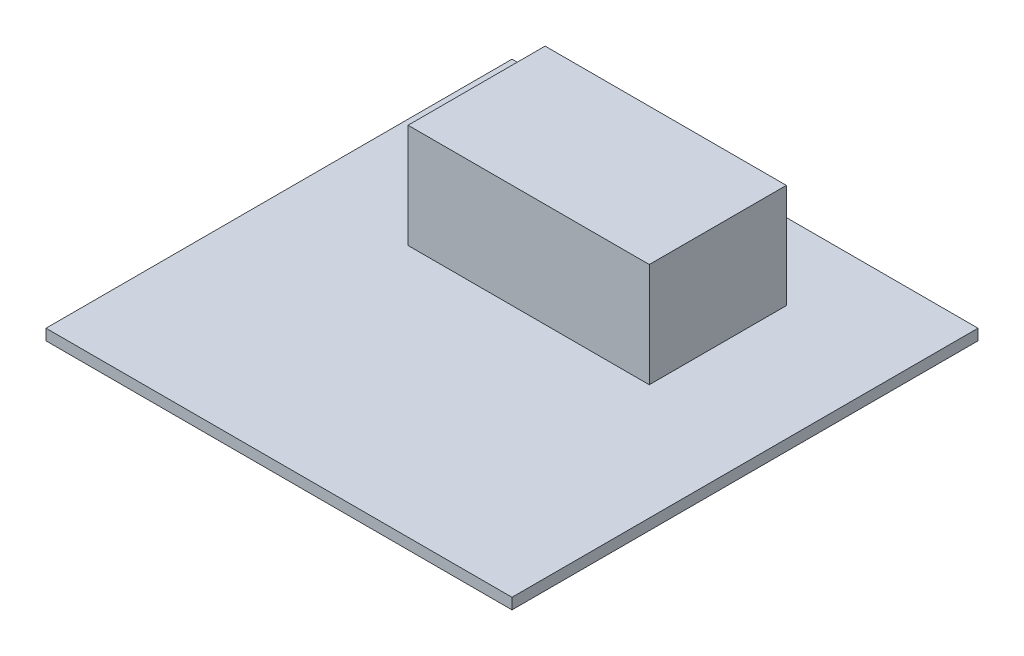
ISO-10303-21;
HEADER;
FILE_DESCRIPTION(('STEP AP214'),'2;1');
FILE_NAME('part.step','',(''),(''),'','','');
FILE_SCHEMA(('AUTOMOTIVE_DESIGN { 1 0 10303 214 1 1 1 1 }'));
ENDSEC;
DATA;
#1=APPLICATION_CONTEXT('core data for automotive mechanical design processes');
#2=APPLICATION_PROTOCOL_DEFINITION('international standard','automotive_design',2000,#1);
#3=PRODUCT_CONTEXT('',#1,'mechanical');
#4=PRODUCT('Part','Part','',(#3));
#5=PRODUCT_RELATED_PRODUCT_CATEGORY('part','',(#4));
#6=PRODUCT_DEFINITION_FORMATION('','',#4);
#7=PRODUCT_DEFINITION_CONTEXT('part definition',#1,'design');
#8=PRODUCT_DEFINITION('design','',#6,#7);
#9=PRODUCT_DEFINITION_SHAPE('','',#8);
#10=(LENGTH_UNIT() NAMED_UNIT(*) SI_UNIT(.MILLI.,.METRE.));
#11=(NAMED_UNIT(*) PLANE_ANGLE_UNIT() SI_UNIT($,.RADIAN.));
#12=(NAMED_UNIT(*) SI_UNIT($,.STERADIAN.) SOLID_ANGLE_UNIT());
#13=UNCERTAINTY_MEASURE_WITH_UNIT(LENGTH_MEASURE(1.E-05),#10,'distance_accuracy_value','');
#14=(GEOMETRIC_REPRESENTATION_CONTEXT(3) GLOBAL_UNCERTAINTY_ASSIGNED_CONTEXT((#13)) GLOBAL_UNIT_ASSIGNED_CONTEXT((#10,
#11,#12)) REPRESENTATION_CONTEXT('',''));
#15=CARTESIAN_POINT('',(0.,0.,0.));
#16=DIRECTION('',(0.,0.,1.));
#17=DIRECTION('',(1.,0.,0.));
#18=AXIS2_PLACEMENT_3D('',#15,#16,#17);
#19=CARTESIAN_POINT('',(0.,4.,0.));
#20=DIRECTION('',(0.,1.,0.));
#21=DIRECTION('',(0.,0.,1.));
#22=AXIS2_PLACEMENT_3D('',#19,#20,#21);
#23=PLANE('',#22);
#24=DIRECTION('',(0.,0.,1.));
#25=VECTOR('',#24,1.);
#26=CARTESIAN_POINT('',(0.,4.,0.));
#27=LINE('',#26,#25);
#28=CARTESIAN_POINT('',(0.,4.,0.));
#29=VERTEX_POINT('',#28);
#30=CARTESIAN_POINT('',(0.,4.,170.));
#31=VERTEX_POINT('',#30);
#32=EDGE_CURVE('E158',#29,#31,#27,.T.);
#33=ORIENTED_EDGE('',*,*,#32,.T.);
#34=DIRECTION('',(1.,0.,0.));
#35=VECTOR('',#34,1.);
#36=CARTESIAN_POINT('',(0.,4.,170.));
#37=LINE('',#36,#35);
#38=CARTESIAN_POINT('',(170.,4.,170.));
#39=VERTEX_POINT('',#38);
#40=EDGE_CURVE('E98',#31,#39,#37,.T.);
#41=ORIENTED_EDGE('',*,*,#40,.T.);
#42=DIRECTION('',(0.,0.,-1.));
#43=VECTOR('',#42,1.);
#44=CARTESIAN_POINT('',(170.,4.,0.));
#45=LINE('',#44,#43);
#46=CARTESIAN_POINT('',(170.,4.,0.));
#47=VERTEX_POINT('',#46);
#48=EDGE_CURVE('E163',#39,#47,#45,.T.);
#49=ORIENTED_EDGE('',*,*,#48,.T.);
#50=DIRECTION('',(-1.,0.,0.));
#51=VECTOR('',#50,1.);
#52=CARTESIAN_POINT('',(0.,4.,0.));
#53=LINE('',#52,#51);
#54=EDGE_CURVE('E70',#47,#29,#53,.T.);
#55=ORIENTED_EDGE('',*,*,#54,.T.);
#56=EDGE_LOOP('',(#33,#41,#49,#55));
#57=FACE_BOUND('',#56,.T.);
#58=DIRECTION('',(1.,0.,0.));
#59=VECTOR('',#58,1.);
#60=CARTESIAN_POINT('',(39.9123901461492,4.,77.8311216564133));
#61=LINE('',#60,#59);
#62=CARTESIAN_POINT('',(39.9123901461492,4.,77.8311216564133));
#63=VERTEX_POINT('',#62);
#64=CARTESIAN_POINT('',(127.912390146149,4.,77.8311216564133));
#65=VERTEX_POINT('',#64);
#66=EDGE_CURVE('E293',#63,#65,#61,.T.);
#67=ORIENTED_EDGE('',*,*,#66,.F.);
#68=DIRECTION('',(0.,0.,1.));
#69=VECTOR('',#68,1.);
#70=CARTESIAN_POINT('',(39.9123901461492,4.,27.8311216564133));
#71=LINE('',#70,#69);
#72=CARTESIAN_POINT('',(39.9123901461492,4.,27.8311216564133));
#73=VERTEX_POINT('',#72);
#74=EDGE_CURVE('E145',#73,#63,#71,.T.);
#75=ORIENTED_EDGE('',*,*,#74,.F.);
#76=DIRECTION('',(-1.,0.,0.));
#77=VECTOR('',#76,1.);
#78=CARTESIAN_POINT('',(39.9123901461492,4.,27.8311216564133));
#79=LINE('',#78,#77);
#80=CARTESIAN_POINT('',(127.912390146149,4.,27.8311216564133));
#81=VERTEX_POINT('',#80);
#82=EDGE_CURVE('E141',#81,#73,#79,.T.);
#83=ORIENTED_EDGE('',*,*,#82,.F.);
#84=DIRECTION('',(0.,0.,-1.));
#85=VECTOR('',#84,1.);
#86=CARTESIAN_POINT('',(127.912390146149,4.,27.8311216564133));
#87=LINE('',#86,#85);
#88=EDGE_CURVE('E289',#65,#81,#87,.T.);
#89=ORIENTED_EDGE('',*,*,#88,.F.);
#90=EDGE_LOOP('',(#67,#75,#83,#89));
#91=FACE_BOUND('',#90,.T.);
#92=ADVANCED_FACE('F45',(#57,#91),#23,.T.);
#93=CARTESIAN_POINT('',(0.,4.,0.));
#94=DIRECTION('',(1.,0.,0.));
#95=DIRECTION('',(0.,0.,-1.));
#96=AXIS2_PLACEMENT_3D('',#93,#94,#95);
#97=PLANE('',#96);
#98=DIRECTION('',(0.,0.,1.));
#99=VECTOR('',#98,1.);
#100=CARTESIAN_POINT('',(0.,0.,0.));
#101=LINE('',#100,#99);
#102=CARTESIAN_POINT('',(0.,0.,0.));
#103=VERTEX_POINT('',#102);
#104=CARTESIAN_POINT('',(0.,0.,170.));
#105=VERTEX_POINT('',#104);
#106=EDGE_CURVE('E148',#103,#105,#101,.T.);
#107=ORIENTED_EDGE('',*,*,#106,.T.);
#108=DIRECTION('',(0.,-1.,0.));
#109=VECTOR('',#108,1.);
#110=CARTESIAN_POINT('',(0.,4.,170.));
#111=LINE('',#110,#109);
#112=EDGE_CURVE('E11',#31,#105,#111,.T.);
#113=ORIENTED_EDGE('',*,*,#112,.F.);
#114=ORIENTED_EDGE('',*,*,#32,.F.);
#115=DIRECTION('',(0.,-1.,0.));
#116=VECTOR('',#115,1.);
#117=CARTESIAN_POINT('',(0.,4.,0.));
#118=LINE('',#117,#116);
#119=EDGE_CURVE('E167',#29,#103,#118,.T.);
#120=ORIENTED_EDGE('',*,*,#119,.T.);
#121=EDGE_LOOP('',(#107,#113,#114,#120));
#122=FACE_BOUND('',#121,.T.);
#123=ADVANCED_FACE('F47',(#122),#97,.F.);
#124=CARTESIAN_POINT('',(0.,4.,170.));
#125=DIRECTION('',(0.,0.,-1.));
#126=DIRECTION('',(-1.,0.,0.));
#127=AXIS2_PLACEMENT_3D('',#124,#125,#126);
#128=PLANE('',#127);
#129=DIRECTION('',(1.,0.,0.));
#130=VECTOR('',#129,1.);
#131=CARTESIAN_POINT('',(0.,0.,170.));
#132=LINE('',#131,#130);
#133=CARTESIAN_POINT('',(170.,0.,170.));
#134=VERTEX_POINT('',#133);
#135=EDGE_CURVE('E153',#105,#134,#132,.T.);
#136=ORIENTED_EDGE('',*,*,#135,.T.);
#137=DIRECTION('',(0.,-1.,0.));
#138=VECTOR('',#137,1.);
#139=CARTESIAN_POINT('',(170.,4.,170.));
#140=LINE('',#139,#138);
#141=EDGE_CURVE('E54',#39,#134,#140,.T.);
#142=ORIENTED_EDGE('',*,*,#141,.F.);
#143=ORIENTED_EDGE('',*,*,#40,.F.);
#144=ORIENTED_EDGE('',*,*,#112,.T.);
#145=EDGE_LOOP('',(#136,#142,#143,#144));
#146=FACE_BOUND('',#145,.T.);
#147=ADVANCED_FACE('F201',(#146),#128,.F.);
#148=CARTESIAN_POINT('',(170.,4.,0.));
#149=DIRECTION('',(-1.,0.,0.));
#150=DIRECTION('',(0.,0.,1.));
#151=AXIS2_PLACEMENT_3D('',#148,#149,#150);
#152=PLANE('',#151);
#153=DIRECTION('',(0.,0.,-1.));
#154=VECTOR('',#153,1.);
#155=CARTESIAN_POINT('',(170.,0.,0.));
#156=LINE('',#155,#154);
#157=CARTESIAN_POINT('',(170.,0.,0.));
#158=VERTEX_POINT('',#157);
#159=EDGE_CURVE('E171',#134,#158,#156,.T.);
#160=ORIENTED_EDGE('',*,*,#159,.T.);
#161=DIRECTION('',(0.,-1.,0.));
#162=VECTOR('',#161,1.);
#163=CARTESIAN_POINT('',(170.,4.,0.));
#164=LINE('',#163,#162);
#165=EDGE_CURVE('E178',#47,#158,#164,.T.);
#166=ORIENTED_EDGE('',*,*,#165,.F.);
#167=ORIENTED_EDGE('',*,*,#48,.F.);
#168=ORIENTED_EDGE('',*,*,#141,.T.);
#169=EDGE_LOOP('',(#160,#166,#167,#168));
#170=FACE_BOUND('',#169,.T.);
#171=ADVANCED_FACE('F185',(#170),#152,.F.);
#172=CARTESIAN_POINT('',(0.,4.,0.));
#173=DIRECTION('',(0.,0.,1.));
#174=DIRECTION('',(1.,0.,0.));
#175=AXIS2_PLACEMENT_3D('',#172,#173,#174);
#176=PLANE('',#175);
#177=DIRECTION('',(-1.,0.,0.));
#178=VECTOR('',#177,1.);
#179=CARTESIAN_POINT('',(0.,0.,0.));
#180=LINE('',#179,#178);
#181=EDGE_CURVE('E91',#158,#103,#180,.T.);
#182=ORIENTED_EDGE('',*,*,#181,.T.);
#183=ORIENTED_EDGE('',*,*,#119,.F.);
#184=ORIENTED_EDGE('',*,*,#54,.F.);
#185=ORIENTED_EDGE('',*,*,#165,.T.);
#186=EDGE_LOOP('',(#182,#183,#184,#185));
#187=FACE_BOUND('',#186,.T.);
#188=ADVANCED_FACE('F193',(#187),#176,.F.);
#189=CARTESIAN_POINT('',(0.,0.,0.));
#190=DIRECTION('',(0.,1.,0.));
#191=DIRECTION('',(0.,0.,1.));
#192=AXIS2_PLACEMENT_3D('',#189,#190,#191);
#193=PLANE('',#192);
#194=ORIENTED_EDGE('',*,*,#106,.F.);
#195=ORIENTED_EDGE('',*,*,#181,.F.);
#196=ORIENTED_EDGE('',*,*,#159,.F.);
#197=ORIENTED_EDGE('',*,*,#135,.F.);
#198=EDGE_LOOP('',(#194,#195,#196,#197));
#199=FACE_BOUND('',#198,.T.);
#200=ADVANCED_FACE('F189',(#199),#193,.F.);
#201=CARTESIAN_POINT('',(39.9123901461492,42.,27.8311216564133));
#202=DIRECTION('',(1.,0.,0.));
#203=DIRECTION('',(0.,0.,-1.));
#204=AXIS2_PLACEMENT_3D('',#201,#202,#203);
#205=PLANE('',#204);
#206=ORIENTED_EDGE('',*,*,#74,.T.);
#207=DIRECTION('',(0.,-1.,0.));
#208=VECTOR('',#207,1.);
#209=CARTESIAN_POINT('',(39.9123901461492,42.,77.8311216564133));
#210=LINE('',#209,#208);
#211=CARTESIAN_POINT('',(39.9123901461492,42.,77.8311216564133));
#212=VERTEX_POINT('',#211);
#213=EDGE_CURVE('E124',#212,#63,#210,.T.);
#214=ORIENTED_EDGE('',*,*,#213,.F.);
#215=DIRECTION('',(0.,0.,1.));
#216=VECTOR('',#215,1.);
#217=CARTESIAN_POINT('',(39.9123901461492,42.,27.8311216564133));
#218=LINE('',#217,#216);
#219=CARTESIAN_POINT('',(39.9123901461492,42.,27.8311216564133));
#220=VERTEX_POINT('',#219);
#221=EDGE_CURVE('E132',#220,#212,#218,.T.);
#222=ORIENTED_EDGE('',*,*,#221,.F.);
#223=DIRECTION('',(0.,-1.,0.));
#224=VECTOR('',#223,1.);
#225=CARTESIAN_POINT('',(39.9123901461492,42.,27.8311216564133));
#226=LINE('',#225,#224);
#227=EDGE_CURVE('E286',#220,#73,#226,.T.);
#228=ORIENTED_EDGE('',*,*,#227,.T.);
#229=EDGE_LOOP('',(#206,#214,#222,#228));
#230=FACE_BOUND('',#229,.T.);
#231=ADVANCED_FACE('F143',(#230),#205,.F.);
#232=CARTESIAN_POINT('',(39.9123901461492,42.,77.8311216564133));
#233=DIRECTION('',(0.,0.,-1.));
#234=DIRECTION('',(-1.,0.,0.));
#235=AXIS2_PLACEMENT_3D('',#232,#233,#234);
#236=PLANE('',#235);
#237=ORIENTED_EDGE('',*,*,#66,.T.);
#238=DIRECTION('',(0.,-1.,0.));
#239=VECTOR('',#238,1.);
#240=CARTESIAN_POINT('',(127.912390146149,42.,77.8311216564133));
#241=LINE('',#240,#239);
#242=CARTESIAN_POINT('',(127.912390146149,42.,77.8311216564133));
#243=VERTEX_POINT('',#242);
#244=EDGE_CURVE('E127',#243,#65,#241,.T.);
#245=ORIENTED_EDGE('',*,*,#244,.F.);
#246=DIRECTION('',(1.,0.,0.));
#247=VECTOR('',#246,1.);
#248=CARTESIAN_POINT('',(39.9123901461492,42.,77.8311216564133));
#249=LINE('',#248,#247);
#250=EDGE_CURVE('E120',#212,#243,#249,.T.);
#251=ORIENTED_EDGE('',*,*,#250,.F.);
#252=ORIENTED_EDGE('',*,*,#213,.T.);
#253=EDGE_LOOP('',(#237,#245,#251,#252));
#254=FACE_BOUND('',#253,.T.);
#255=ADVANCED_FACE('F122',(#254),#236,.F.);
#256=CARTESIAN_POINT('',(127.912390146149,42.,27.8311216564133));
#257=DIRECTION('',(-1.,0.,0.));
#258=DIRECTION('',(0.,0.,1.));
#259=AXIS2_PLACEMENT_3D('',#256,#257,#258);
#260=PLANE('',#259);
#261=ORIENTED_EDGE('',*,*,#88,.T.);
#262=DIRECTION('',(0.,-1.,0.));
#263=VECTOR('',#262,1.);
#264=CARTESIAN_POINT('',(127.912390146149,42.,27.8311216564133));
#265=LINE('',#264,#263);
#266=CARTESIAN_POINT('',(127.912390146149,42.,27.8311216564133));
#267=VERTEX_POINT('',#266);
#268=EDGE_CURVE('E61',#267,#81,#265,.T.);
#269=ORIENTED_EDGE('',*,*,#268,.F.);
#270=DIRECTION('',(0.,0.,-1.));
#271=VECTOR('',#270,1.);
#272=CARTESIAN_POINT('',(127.912390146149,42.,27.8311216564133));
#273=LINE('',#272,#271);
#274=EDGE_CURVE('E131',#243,#267,#273,.T.);
#275=ORIENTED_EDGE('',*,*,#274,.F.);
#276=ORIENTED_EDGE('',*,*,#244,.T.);
#277=EDGE_LOOP('',(#261,#269,#275,#276));
#278=FACE_BOUND('',#277,.T.);
#279=ADVANCED_FACE('F214',(#278),#260,.F.);
#280=CARTESIAN_POINT('',(39.9123901461492,42.,27.8311216564133));
#281=DIRECTION('',(0.,0.,1.));
#282=DIRECTION('',(1.,0.,0.));
#283=AXIS2_PLACEMENT_3D('',#280,#281,#282);
#284=PLANE('',#283);
#285=ORIENTED_EDGE('',*,*,#82,.T.);
#286=ORIENTED_EDGE('',*,*,#227,.F.);
#287=DIRECTION('',(-1.,0.,0.));
#288=VECTOR('',#287,1.);
#289=CARTESIAN_POINT('',(39.9123901461492,42.,27.8311216564133));
#290=LINE('',#289,#288);
#291=EDGE_CURVE('E136',#267,#220,#290,.T.);
#292=ORIENTED_EDGE('',*,*,#291,.F.);
#293=ORIENTED_EDGE('',*,*,#268,.T.);
#294=EDGE_LOOP('',(#285,#286,#292,#293));
#295=FACE_BOUND('',#294,.T.);
#296=ADVANCED_FACE('F217',(#295),#284,.F.);
#297=CARTESIAN_POINT('',(0.,42.,0.));
#298=DIRECTION('',(0.,1.,0.));
#299=DIRECTION('',(0.,0.,1.));
#300=AXIS2_PLACEMENT_3D('',#297,#298,#299);
#301=PLANE('',#300);
#302=ORIENTED_EDGE('',*,*,#221,.T.);
#303=ORIENTED_EDGE('',*,*,#250,.T.);
#304=ORIENTED_EDGE('',*,*,#274,.T.);
#305=ORIENTED_EDGE('',*,*,#291,.T.);
#306=EDGE_LOOP('',(#302,#303,#304,#305));
#307=FACE_BOUND('',#306,.T.);
#308=ADVANCED_FACE('F135',(#307),#301,.T.);
#309=CLOSED_SHELL('',(#92,#123,#147,#171,#188,#200,#231,#255,#279,#296,#308));
#310=MANIFOLD_SOLID_BREP('B2',#309);
#311=ADVANCED_BREP_SHAPE_REPRESENTATION('',(#18,#310),#14);
#312=SHAPE_DEFINITION_REPRESENTATION(#9,#311);
ENDSEC;
END-ISO-10303-21;
